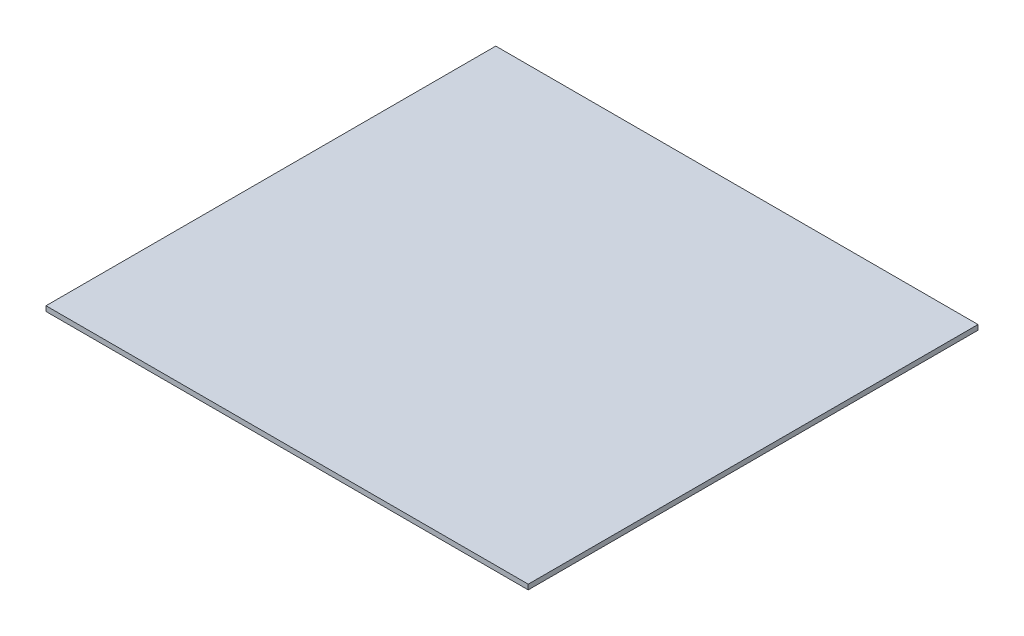
ISO-10303-21;
HEADER;
FILE_DESCRIPTION(('STEP AP214'),'2;1');
FILE_NAME('part.step','',(''),(''),'','','');
FILE_SCHEMA(('AUTOMOTIVE_DESIGN { 1 0 10303 214 1 1 1 1 }'));
ENDSEC;
DATA;
#1=APPLICATION_CONTEXT('core data for automotive mechanical design processes');
#2=APPLICATION_PROTOCOL_DEFINITION('international standard','automotive_design',2000,#1);
#3=PRODUCT_CONTEXT('',#1,'mechanical');
#4=PRODUCT('Part','Part','',(#3));
#5=PRODUCT_RELATED_PRODUCT_CATEGORY('part','',(#4));
#6=PRODUCT_DEFINITION_FORMATION('','',#4);
#7=PRODUCT_DEFINITION_CONTEXT('part definition',#1,'design');
#8=PRODUCT_DEFINITION('design','',#6,#7);
#9=PRODUCT_DEFINITION_SHAPE('','',#8);
#10=(LENGTH_UNIT() NAMED_UNIT(*) SI_UNIT(.MILLI.,.METRE.));
#11=(NAMED_UNIT(*) PLANE_ANGLE_UNIT() SI_UNIT($,.RADIAN.));
#12=(NAMED_UNIT(*) SI_UNIT($,.STERADIAN.) SOLID_ANGLE_UNIT());
#13=UNCERTAINTY_MEASURE_WITH_UNIT(LENGTH_MEASURE(1.E-05),#10,'distance_accuracy_value','');
#14=(GEOMETRIC_REPRESENTATION_CONTEXT(3) GLOBAL_UNCERTAINTY_ASSIGNED_CONTEXT((#13)) GLOBAL_UNIT_ASSIGNED_CONTEXT((#10,
#11,#12)) REPRESENTATION_CONTEXT('',''));
#15=CARTESIAN_POINT('',(0.,0.,0.));
#16=DIRECTION('',(0.,0.,1.));
#17=DIRECTION('',(1.,0.,0.));
#18=AXIS2_PLACEMENT_3D('',#15,#16,#17);
#19=CARTESIAN_POINT('',(-4.825,0.1,-4.5));
#20=DIRECTION('',(1.,0.,0.));
#21=DIRECTION('',(0.,0.,-1.));
#22=AXIS2_PLACEMENT_3D('',#19,#20,#21);
#23=PLANE('',#22);
#24=DIRECTION('',(0.,0.,1.));
#25=VECTOR('',#24,1.);
#26=CARTESIAN_POINT('',(-4.825,0.,-4.5));
#27=LINE('',#26,#25);
#28=CARTESIAN_POINT('',(-4.825,0.,-4.5));
#29=VERTEX_POINT('',#28);
#30=CARTESIAN_POINT('',(-4.825,0.,4.5));
#31=VERTEX_POINT('',#30);
#32=EDGE_CURVE('E95',#29,#31,#27,.T.);
#33=ORIENTED_EDGE('',*,*,#32,.T.);
#34=DIRECTION('',(0.,-1.,0.));
#35=VECTOR('',#34,1.);
#36=CARTESIAN_POINT('',(-4.825,0.1,4.5));
#37=LINE('',#36,#35);
#38=CARTESIAN_POINT('',(-4.825,0.1,4.5));
#39=VERTEX_POINT('',#38);
#40=EDGE_CURVE('E11',#39,#31,#37,.T.);
#41=ORIENTED_EDGE('',*,*,#40,.F.);
#42=DIRECTION('',(0.,0.,1.));
#43=VECTOR('',#42,1.);
#44=CARTESIAN_POINT('',(-4.825,0.1,-4.5));
#45=LINE('',#44,#43);
#46=CARTESIAN_POINT('',(-4.825,0.1,-4.5));
#47=VERTEX_POINT('',#46);
#48=EDGE_CURVE('E83',#47,#39,#45,.T.);
#49=ORIENTED_EDGE('',*,*,#48,.F.);
#50=DIRECTION('',(0.,-1.,0.));
#51=VECTOR('',#50,1.);
#52=CARTESIAN_POINT('',(-4.825,0.1,-4.5));
#53=LINE('',#52,#51);
#54=EDGE_CURVE('E91',#47,#29,#53,.T.);
#55=ORIENTED_EDGE('',*,*,#54,.T.);
#56=EDGE_LOOP('',(#33,#41,#49,#55));
#57=FACE_BOUND('',#56,.T.);
#58=ADVANCED_FACE('F32',(#57),#23,.F.);
#59=CARTESIAN_POINT('',(-4.825,0.1,4.5));
#60=DIRECTION('',(0.,0.,-1.));
#61=DIRECTION('',(-1.,0.,0.));
#62=AXIS2_PLACEMENT_3D('',#59,#60,#61);
#63=PLANE('',#62);
#64=DIRECTION('',(1.,0.,0.));
#65=VECTOR('',#64,1.);
#66=CARTESIAN_POINT('',(-4.825,0.,4.5));
#67=LINE('',#66,#65);
#68=CARTESIAN_POINT('',(4.825,0.,4.5));
#69=VERTEX_POINT('',#68);
#70=EDGE_CURVE('E87',#31,#69,#67,.T.);
#71=ORIENTED_EDGE('',*,*,#70,.T.);
#72=DIRECTION('',(0.,-1.,0.));
#73=VECTOR('',#72,1.);
#74=CARTESIAN_POINT('',(4.825,0.1,4.5));
#75=LINE('',#74,#73);
#76=CARTESIAN_POINT('',(4.825,0.1,4.5));
#77=VERTEX_POINT('',#76);
#78=EDGE_CURVE('E40',#77,#69,#75,.T.);
#79=ORIENTED_EDGE('',*,*,#78,.F.);
#80=DIRECTION('',(1.,0.,0.));
#81=VECTOR('',#80,1.);
#82=CARTESIAN_POINT('',(-4.825,0.1,4.5));
#83=LINE('',#82,#81);
#84=EDGE_CURVE('E78',#39,#77,#83,.T.);
#85=ORIENTED_EDGE('',*,*,#84,.F.);
#86=ORIENTED_EDGE('',*,*,#40,.T.);
#87=EDGE_LOOP('',(#71,#79,#85,#86));
#88=FACE_BOUND('',#87,.T.);
#89=ADVANCED_FACE('F86',(#88),#63,.F.);
#90=CARTESIAN_POINT('',(4.825,0.1,-4.5));
#91=DIRECTION('',(-1.,0.,0.));
#92=DIRECTION('',(0.,0.,1.));
#93=AXIS2_PLACEMENT_3D('',#90,#91,#92);
#94=PLANE('',#93);
#95=DIRECTION('',(0.,0.,-1.));
#96=VECTOR('',#95,1.);
#97=CARTESIAN_POINT('',(4.825,0.,-4.5));
#98=LINE('',#97,#96);
#99=CARTESIAN_POINT('',(4.825,0.,-4.5));
#100=VERTEX_POINT('',#99);
#101=EDGE_CURVE('E65',#69,#100,#98,.T.);
#102=ORIENTED_EDGE('',*,*,#101,.T.);
#103=DIRECTION('',(0.,-1.,0.));
#104=VECTOR('',#103,1.);
#105=CARTESIAN_POINT('',(4.825,0.1,-4.5));
#106=LINE('',#105,#104);
#107=CARTESIAN_POINT('',(4.825,0.1,-4.5));
#108=VERTEX_POINT('',#107);
#109=EDGE_CURVE('E88',#108,#100,#106,.T.);
#110=ORIENTED_EDGE('',*,*,#109,.F.);
#111=DIRECTION('',(0.,0.,-1.));
#112=VECTOR('',#111,1.);
#113=CARTESIAN_POINT('',(4.825,0.1,-4.5));
#114=LINE('',#113,#112);
#115=EDGE_CURVE('E81',#77,#108,#114,.T.);
#116=ORIENTED_EDGE('',*,*,#115,.F.);
#117=ORIENTED_EDGE('',*,*,#78,.T.);
#118=EDGE_LOOP('',(#102,#110,#116,#117));
#119=FACE_BOUND('',#118,.T.);
#120=ADVANCED_FACE('F89',(#119),#94,.F.);
#121=CARTESIAN_POINT('',(-4.825,0.1,-4.5));
#122=DIRECTION('',(0.,0.,1.));
#123=DIRECTION('',(1.,0.,0.));
#124=AXIS2_PLACEMENT_3D('',#121,#122,#123);
#125=PLANE('',#124);
#126=DIRECTION('',(-1.,0.,0.));
#127=VECTOR('',#126,1.);
#128=CARTESIAN_POINT('',(-4.825,0.,-4.5));
#129=LINE('',#128,#127);
#130=EDGE_CURVE('E71',#100,#29,#129,.T.);
#131=ORIENTED_EDGE('',*,*,#130,.T.);
#132=ORIENTED_EDGE('',*,*,#54,.F.);
#133=DIRECTION('',(-1.,0.,0.));
#134=VECTOR('',#133,1.);
#135=CARTESIAN_POINT('',(-4.825,0.1,-4.5));
#136=LINE('',#135,#134);
#137=EDGE_CURVE('E48',#108,#47,#136,.T.);
#138=ORIENTED_EDGE('',*,*,#137,.F.);
#139=ORIENTED_EDGE('',*,*,#109,.T.);
#140=EDGE_LOOP('',(#131,#132,#138,#139));
#141=FACE_BOUND('',#140,.T.);
#142=ADVANCED_FACE('F102',(#141),#125,.F.);
#143=CARTESIAN_POINT('',(0.,0.1,0.));
#144=DIRECTION('',(0.,1.,0.));
#145=DIRECTION('',(0.,0.,1.));
#146=AXIS2_PLACEMENT_3D('',#143,#144,#145);
#147=PLANE('',#146);
#148=ORIENTED_EDGE('',*,*,#48,.T.);
#149=ORIENTED_EDGE('',*,*,#84,.T.);
#150=ORIENTED_EDGE('',*,*,#115,.T.);
#151=ORIENTED_EDGE('',*,*,#137,.T.);
#152=EDGE_LOOP('',(#148,#149,#150,#151));
#153=FACE_BOUND('',#152,.T.);
#154=ADVANCED_FACE('F79',(#153),#147,.T.);
#155=CARTESIAN_POINT('',(0.,0.,0.));
#156=DIRECTION('',(0.,1.,0.));
#157=DIRECTION('',(0.,0.,1.));
#158=AXIS2_PLACEMENT_3D('',#155,#156,#157);
#159=PLANE('',#158);
#160=ORIENTED_EDGE('',*,*,#32,.F.);
#161=ORIENTED_EDGE('',*,*,#130,.F.);
#162=ORIENTED_EDGE('',*,*,#101,.F.);
#163=ORIENTED_EDGE('',*,*,#70,.F.);
#164=EDGE_LOOP('',(#160,#161,#162,#163));
#165=FACE_BOUND('',#164,.T.);
#166=ADVANCED_FACE('F105',(#165),#159,.F.);
#167=CLOSED_SHELL('',(#58,#89,#120,#142,#154,#166));
#168=MANIFOLD_SOLID_BREP('B2',#167);
#169=ADVANCED_BREP_SHAPE_REPRESENTATION('',(#18,#168),#14);
#170=SHAPE_DEFINITION_REPRESENTATION(#9,#169);
ENDSEC;
END-ISO-10303-21;
